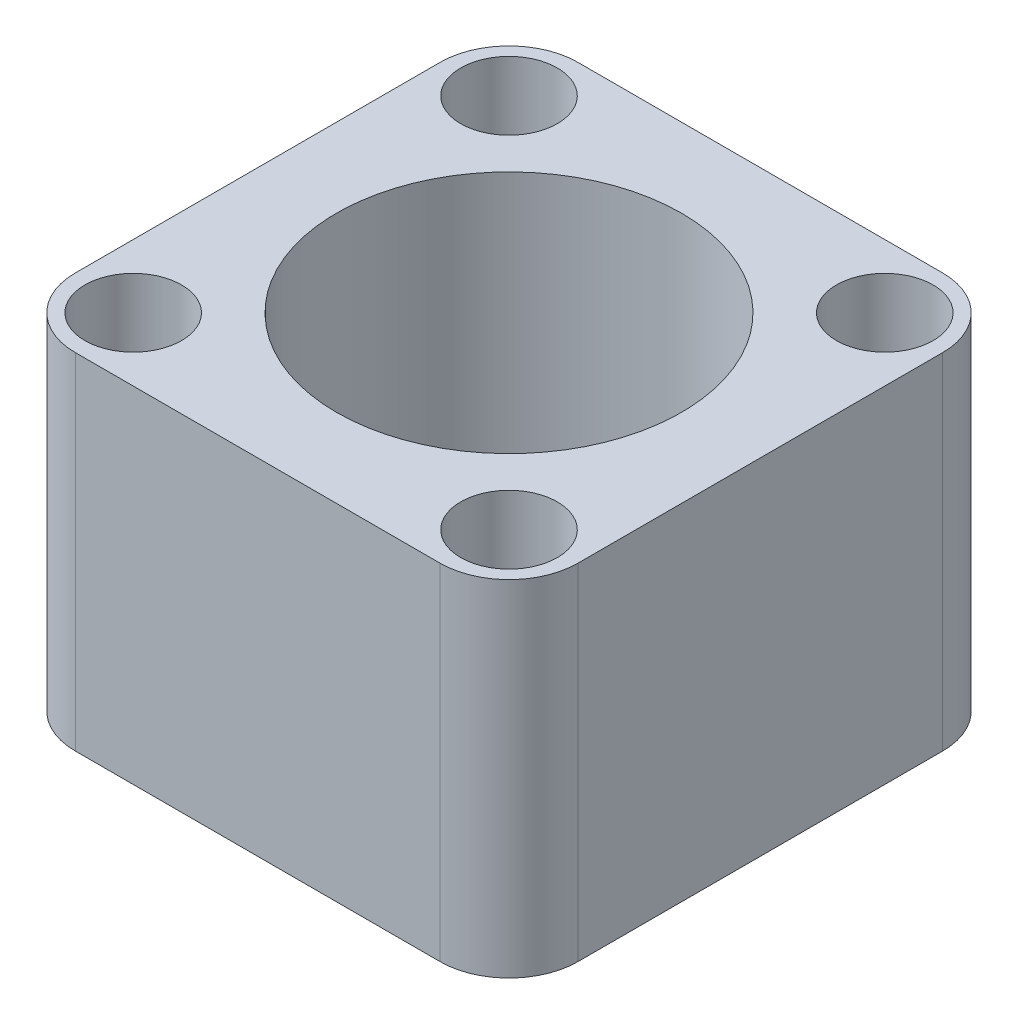
ISO-10303-21;
HEADER;
FILE_DESCRIPTION(('STEP AP214'),'2;1');
FILE_NAME('part.step','',(''),(''),'','','');
FILE_SCHEMA(('AUTOMOTIVE_DESIGN { 1 0 10303 214 1 1 1 1 }'));
ENDSEC;
DATA;
#1=APPLICATION_CONTEXT('core data for automotive mechanical design processes');
#2=APPLICATION_PROTOCOL_DEFINITION('international standard','automotive_design',2000,#1);
#3=PRODUCT_CONTEXT('',#1,'mechanical');
#4=PRODUCT('Part','Part','',(#3));
#5=PRODUCT_RELATED_PRODUCT_CATEGORY('part','',(#4));
#6=PRODUCT_DEFINITION_FORMATION('','',#4);
#7=PRODUCT_DEFINITION_CONTEXT('part definition',#1,'design');
#8=PRODUCT_DEFINITION('design','',#6,#7);
#9=PRODUCT_DEFINITION_SHAPE('','',#8);
#10=(LENGTH_UNIT() NAMED_UNIT(*) SI_UNIT(.MILLI.,.METRE.));
#11=(NAMED_UNIT(*) PLANE_ANGLE_UNIT() SI_UNIT($,.RADIAN.));
#12=(NAMED_UNIT(*) SI_UNIT($,.STERADIAN.) SOLID_ANGLE_UNIT());
#13=UNCERTAINTY_MEASURE_WITH_UNIT(LENGTH_MEASURE(1.E-05),#10,'distance_accuracy_value','');
#14=(GEOMETRIC_REPRESENTATION_CONTEXT(3) GLOBAL_UNCERTAINTY_ASSIGNED_CONTEXT((#13)) GLOBAL_UNIT_ASSIGNED_CONTEXT((#10,
#11,#12)) REPRESENTATION_CONTEXT('',''));
#15=CARTESIAN_POINT('',(0.,0.,0.));
#16=DIRECTION('',(0.,0.,1.));
#17=DIRECTION('',(1.,0.,0.));
#18=AXIS2_PLACEMENT_3D('',#15,#16,#17);
#19=CARTESIAN_POINT('',(0.,12.7,0.));
#20=DIRECTION('',(-1.,0.,0.));
#21=DIRECTION('',(0.,0.,1.));
#22=AXIS2_PLACEMENT_3D('',#19,#20,#21);
#23=PLANE('',#22);
#24=DIRECTION('',(0.,0.,-1.));
#25=VECTOR('',#24,1.);
#26=CARTESIAN_POINT('',(0.,12.7,0.));
#27=LINE('',#26,#25);
#28=CARTESIAN_POINT('',(0.,12.7,-2.54));
#29=VERTEX_POINT('',#28);
#30=CARTESIAN_POINT('',(0.,12.7,-15.9593276094025));
#31=VERTEX_POINT('',#30);
#32=EDGE_CURVE('E120',#29,#31,#27,.T.);
#33=ORIENTED_EDGE('',*,*,#32,.F.);
#34=DIRECTION('',(0.,-1.,0.));
#35=VECTOR('',#34,1.);
#36=CARTESIAN_POINT('',(0.,0.,-2.54));
#37=LINE('',#36,#35);
#38=CARTESIAN_POINT('',(0.,0.,-2.54));
#39=VERTEX_POINT('',#38);
#40=EDGE_CURVE('E150',#29,#39,#37,.T.);
#41=ORIENTED_EDGE('',*,*,#40,.T.);
#42=DIRECTION('',(0.,0.,-1.));
#43=VECTOR('',#42,1.);
#44=CARTESIAN_POINT('',(0.,0.,0.));
#45=LINE('',#44,#43);
#46=CARTESIAN_POINT('',(0.,0.,-15.9593276094025));
#47=VERTEX_POINT('',#46);
#48=EDGE_CURVE('E104',#39,#47,#45,.T.);
#49=ORIENTED_EDGE('',*,*,#48,.T.);
#50=DIRECTION('',(0.,-1.,0.));
#51=VECTOR('',#50,1.);
#52=CARTESIAN_POINT('',(0.,12.7,-15.9593276094025));
#53=LINE('',#52,#51);
#54=EDGE_CURVE('E148',#47,#31,#53,.F.);
#55=ORIENTED_EDGE('',*,*,#54,.T.);
#56=EDGE_LOOP('',(#33,#41,#49,#55));
#57=FACE_BOUND('',#56,.T.);
#58=ADVANCED_FACE('F33',(#57),#23,.F.);
#59=CARTESIAN_POINT('',(0.,12.7,-18.4993276094025));
#60=DIRECTION('',(0.,0.,1.));
#61=DIRECTION('',(1.,0.,0.));
#62=AXIS2_PLACEMENT_3D('',#59,#60,#61);
#63=PLANE('',#62);
#64=DIRECTION('',(-1.,0.,0.));
#65=VECTOR('',#64,1.);
#66=CARTESIAN_POINT('',(0.,12.7,-18.4993276094025));
#67=LINE('',#66,#65);
#68=CARTESIAN_POINT('',(-2.54,12.7,-18.4993276094025));
#69=VERTEX_POINT('',#68);
#70=CARTESIAN_POINT('',(-15.9593276094025,12.7,-18.4993276094025));
#71=VERTEX_POINT('',#70);
#72=EDGE_CURVE('E154',#69,#71,#67,.T.);
#73=ORIENTED_EDGE('',*,*,#72,.F.);
#74=DIRECTION('',(0.,-1.,0.));
#75=VECTOR('',#74,1.);
#76=CARTESIAN_POINT('',(-2.54,12.7,-18.4993276094025));
#77=LINE('',#76,#75);
#78=CARTESIAN_POINT('',(-2.54,0.,-18.4993276094025));
#79=VERTEX_POINT('',#78);
#80=EDGE_CURVE('E11',#69,#79,#77,.T.);
#81=ORIENTED_EDGE('',*,*,#80,.T.);
#82=DIRECTION('',(-1.,0.,0.));
#83=VECTOR('',#82,1.);
#84=CARTESIAN_POINT('',(0.,0.,-18.4993276094025));
#85=LINE('',#84,#83);
#86=CARTESIAN_POINT('',(-15.9593276094025,0.,-18.4993276094025));
#87=VERTEX_POINT('',#86);
#88=EDGE_CURVE('E164',#79,#87,#85,.T.);
#89=ORIENTED_EDGE('',*,*,#88,.T.);
#90=DIRECTION('',(0.,-1.,0.));
#91=VECTOR('',#90,1.);
#92=CARTESIAN_POINT('',(-15.9593276094025,12.7,-18.4993276094025));
#93=LINE('',#92,#91);
#94=EDGE_CURVE('E41',#87,#71,#93,.F.);
#95=ORIENTED_EDGE('',*,*,#94,.T.);
#96=EDGE_LOOP('',(#73,#81,#89,#95));
#97=FACE_BOUND('',#96,.T.);
#98=ADVANCED_FACE('F191',(#97),#63,.F.);
#99=CARTESIAN_POINT('',(-18.4993276094025,12.7,0.));
#100=DIRECTION('',(-1.,0.,0.));
#101=DIRECTION('',(0.,0.,1.));
#102=AXIS2_PLACEMENT_3D('',#99,#100,#101);
#103=PLANE('',#102);
#104=DIRECTION('',(0.,0.,-1.));
#105=VECTOR('',#104,1.);
#106=CARTESIAN_POINT('',(-18.4993276094025,0.,0.));
#107=LINE('',#106,#105);
#108=CARTESIAN_POINT('',(-18.4993276094025,0.,-2.54));
#109=VERTEX_POINT('',#108);
#110=CARTESIAN_POINT('',(-18.4993276094025,0.,-15.9593276094025));
#111=VERTEX_POINT('',#110);
#112=EDGE_CURVE('E121',#109,#111,#107,.T.);
#113=ORIENTED_EDGE('',*,*,#112,.F.);
#114=DIRECTION('',(0.,-1.,0.));
#115=VECTOR('',#114,1.);
#116=CARTESIAN_POINT('',(-18.4993276094025,12.7,-2.54));
#117=LINE('',#116,#115);
#118=CARTESIAN_POINT('',(-18.4993276094025,12.7,-2.54));
#119=VERTEX_POINT('',#118);
#120=EDGE_CURVE('E140',#109,#119,#117,.F.);
#121=ORIENTED_EDGE('',*,*,#120,.T.);
#122=DIRECTION('',(0.,0.,-1.));
#123=VECTOR('',#122,1.);
#124=CARTESIAN_POINT('',(-18.4993276094025,12.7,0.));
#125=LINE('',#124,#123);
#126=CARTESIAN_POINT('',(-18.4993276094025,12.7,-15.9593276094025));
#127=VERTEX_POINT('',#126);
#128=EDGE_CURVE('E130',#119,#127,#125,.T.);
#129=ORIENTED_EDGE('',*,*,#128,.T.);
#130=DIRECTION('',(0.,-1.,0.));
#131=VECTOR('',#130,1.);
#132=CARTESIAN_POINT('',(-18.4993276094025,0.,-15.9593276094025));
#133=LINE('',#132,#131);
#134=EDGE_CURVE('E137',#127,#111,#133,.T.);
#135=ORIENTED_EDGE('',*,*,#134,.T.);
#136=EDGE_LOOP('',(#113,#121,#129,#135));
#137=FACE_BOUND('',#136,.T.);
#138=ADVANCED_FACE('F170',(#137),#103,.T.);
#139=CARTESIAN_POINT('',(0.,12.7,0.));
#140=DIRECTION('',(0.,0.,1.));
#141=DIRECTION('',(1.,0.,0.));
#142=AXIS2_PLACEMENT_3D('',#139,#140,#141);
#143=PLANE('',#142);
#144=DIRECTION('',(-1.,0.,0.));
#145=VECTOR('',#144,1.);
#146=CARTESIAN_POINT('',(0.,12.7,0.));
#147=LINE('',#146,#145);
#148=CARTESIAN_POINT('',(-2.54,12.7,0.));
#149=VERTEX_POINT('',#148);
#150=CARTESIAN_POINT('',(-15.9593276094025,12.7,0.));
#151=VERTEX_POINT('',#150);
#152=EDGE_CURVE('E126',#149,#151,#147,.T.);
#153=ORIENTED_EDGE('',*,*,#152,.T.);
#154=DIRECTION('',(0.,-1.,0.));
#155=VECTOR('',#154,1.);
#156=CARTESIAN_POINT('',(-15.9593276094025,12.7,0.));
#157=LINE('',#156,#155);
#158=CARTESIAN_POINT('',(-15.9593276094025,0.,0.));
#159=VERTEX_POINT('',#158);
#160=EDGE_CURVE('E119',#151,#159,#157,.T.);
#161=ORIENTED_EDGE('',*,*,#160,.T.);
#162=DIRECTION('',(-1.,0.,0.));
#163=VECTOR('',#162,1.);
#164=CARTESIAN_POINT('',(0.,0.,0.));
#165=LINE('',#164,#163);
#166=CARTESIAN_POINT('',(-2.54,0.,0.));
#167=VERTEX_POINT('',#166);
#168=EDGE_CURVE('E102',#167,#159,#165,.T.);
#169=ORIENTED_EDGE('',*,*,#168,.F.);
#170=DIRECTION('',(0.,-1.,0.));
#171=VECTOR('',#170,1.);
#172=CARTESIAN_POINT('',(-2.54,12.7,0.));
#173=LINE('',#172,#171);
#174=EDGE_CURVE('E116',#167,#149,#173,.F.);
#175=ORIENTED_EDGE('',*,*,#174,.T.);
#176=EDGE_LOOP('',(#153,#161,#169,#175));
#177=FACE_BOUND('',#176,.T.);
#178=ADVANCED_FACE('F115',(#177),#143,.T.);
#179=CARTESIAN_POINT('',(0.,12.7,0.));
#180=DIRECTION('',(0.,1.,0.));
#181=DIRECTION('',(0.,0.,1.));
#182=AXIS2_PLACEMENT_3D('',#179,#180,#181);
#183=PLANE('',#182);
#184=CARTESIAN_POINT('',(-2.33486659147798,12.7,-16.1644610179245));
#185=DIRECTION('',(0.,1.,0.));
#186=DIRECTION('',(0.,0.,-1.));
#187=AXIS2_PLACEMENT_3D('',#184,#185,#186);
#188=CIRCLE('',#187,1.778);
#189=CARTESIAN_POINT('',(-2.33486659147798,12.7,-14.3864610179245));
#190=VERTEX_POINT('',#189);
#191=EDGE_CURVE('E318',#190,#190,#188,.T.);
#192=ORIENTED_EDGE('',*,*,#191,.F.);
#193=EDGE_LOOP('',(#192));
#194=FACE_BOUND('',#193,.T.);
#195=CARTESIAN_POINT('',(-16.1644610179245,12.7,-16.1644610179245));
#196=DIRECTION('',(0.,1.,0.));
#197=DIRECTION('',(0.,0.,-1.));
#198=AXIS2_PLACEMENT_3D('',#195,#196,#197);
#199=CIRCLE('',#198,1.778);
#200=CARTESIAN_POINT('',(-16.1644610179245,12.7,-14.3864610179245));
#201=VERTEX_POINT('',#200);
#202=EDGE_CURVE('E320',#201,#201,#199,.T.);
#203=ORIENTED_EDGE('',*,*,#202,.F.);
#204=EDGE_LOOP('',(#203));
#205=FACE_BOUND('',#204,.T.);
#206=CARTESIAN_POINT('',(-16.1644610179245,12.7,-2.33486659147798));
#207=DIRECTION('',(0.,1.,0.));
#208=DIRECTION('',(0.,0.,1.));
#209=AXIS2_PLACEMENT_3D('',#206,#207,#208);
#210=CIRCLE('',#209,1.778);
#211=CARTESIAN_POINT('',(-16.1644610179245,12.7,-0.556866591477977));
#212=VERTEX_POINT('',#211);
#213=EDGE_CURVE('E328',#212,#212,#210,.T.);
#214=ORIENTED_EDGE('',*,*,#213,.F.);
#215=EDGE_LOOP('',(#214));
#216=FACE_BOUND('',#215,.T.);
#217=CARTESIAN_POINT('',(-2.33486659147798,12.7,-2.33486659147798));
#218=DIRECTION('',(0.,1.,0.));
#219=DIRECTION('',(0.,0.,1.));
#220=AXIS2_PLACEMENT_3D('',#217,#218,#219);
#221=CIRCLE('',#220,1.778);
#222=CARTESIAN_POINT('',(-2.33486659147798,12.7,-0.556866591477977));
#223=VERTEX_POINT('',#222);
#224=EDGE_CURVE('E334',#223,#223,#221,.T.);
#225=ORIENTED_EDGE('',*,*,#224,.F.);
#226=EDGE_LOOP('',(#225));
#227=FACE_BOUND('',#226,.T.);
#228=CARTESIAN_POINT('',(-9.24966380470123,12.7,-9.24966380470123));
#229=DIRECTION('',(0.,1.,0.));
#230=DIRECTION('',(0.,0.,1.));
#231=AXIS2_PLACEMENT_3D('',#228,#229,#230);
#232=CIRCLE('',#231,6.35);
#233=CARTESIAN_POINT('',(-9.24966380470123,12.7,-2.89966380470123));
#234=VERTEX_POINT('',#233);
#235=EDGE_CURVE('E339',#234,#234,#232,.T.);
#236=ORIENTED_EDGE('',*,*,#235,.F.);
#237=EDGE_LOOP('',(#236));
#238=FACE_BOUND('',#237,.T.);
#239=ORIENTED_EDGE('',*,*,#128,.F.);
#240=CARTESIAN_POINT('',(-15.9593276094025,12.7,-2.54));
#241=DIRECTION('',(0.,1.,0.));
#242=DIRECTION('',(0.,0.,1.));
#243=AXIS2_PLACEMENT_3D('',#240,#241,#242);
#244=CIRCLE('',#243,2.54);
#245=EDGE_CURVE('E146',#119,#151,#244,.T.);
#246=ORIENTED_EDGE('',*,*,#245,.T.);
#247=ORIENTED_EDGE('',*,*,#152,.F.);
#248=CARTESIAN_POINT('',(-2.54,12.7,-2.54));
#249=DIRECTION('',(0.,1.,0.));
#250=DIRECTION('',(0.,0.,1.));
#251=AXIS2_PLACEMENT_3D('',#248,#249,#250);
#252=CIRCLE('',#251,2.54);
#253=EDGE_CURVE('E125',#149,#29,#252,.T.);
#254=ORIENTED_EDGE('',*,*,#253,.T.);
#255=ORIENTED_EDGE('',*,*,#32,.T.);
#256=CARTESIAN_POINT('',(-2.54,12.7,-15.9593276094025));
#257=DIRECTION('',(0.,1.,0.));
#258=DIRECTION('',(0.,0.,1.));
#259=AXIS2_PLACEMENT_3D('',#256,#257,#258);
#260=CIRCLE('',#259,2.54);
#261=EDGE_CURVE('E54',#31,#69,#260,.T.);
#262=ORIENTED_EDGE('',*,*,#261,.T.);
#263=ORIENTED_EDGE('',*,*,#72,.T.);
#264=CARTESIAN_POINT('',(-15.9593276094025,12.7,-15.9593276094025));
#265=DIRECTION('',(0.,1.,0.));
#266=DIRECTION('',(0.,0.,1.));
#267=AXIS2_PLACEMENT_3D('',#264,#265,#266);
#268=CIRCLE('',#267,2.54);
#269=EDGE_CURVE('E142',#71,#127,#268,.T.);
#270=ORIENTED_EDGE('',*,*,#269,.T.);
#271=EDGE_LOOP('',(#239,#246,#247,#254,#255,#262,#263,#270));
#272=FACE_BOUND('',#271,.T.);
#273=ADVANCED_FACE('F176',(#194,#205,#216,#227,#238,#272),#183,.T.);
#274=CARTESIAN_POINT('',(0.,0.,0.));
#275=DIRECTION('',(0.,1.,0.));
#276=DIRECTION('',(0.,0.,1.));
#277=AXIS2_PLACEMENT_3D('',#274,#275,#276);
#278=PLANE('',#277);
#279=CARTESIAN_POINT('',(-2.33486659147798,0.,-16.1644610179245));
#280=DIRECTION('',(0.,1.,0.));
#281=DIRECTION('',(0.,0.,1.));
#282=AXIS2_PLACEMENT_3D('',#279,#280,#281);
#283=CIRCLE('',#282,1.778);
#284=CARTESIAN_POINT('',(-2.33486659147798,0.,-14.3864610179245));
#285=VERTEX_POINT('',#284);
#286=EDGE_CURVE('E315',#285,#285,#283,.F.);
#287=ORIENTED_EDGE('',*,*,#286,.F.);
#288=EDGE_LOOP('',(#287));
#289=FACE_BOUND('',#288,.T.);
#290=CARTESIAN_POINT('',(-16.1644610179245,0.,-16.1644610179245));
#291=DIRECTION('',(0.,1.,0.));
#292=DIRECTION('',(0.,0.,1.));
#293=AXIS2_PLACEMENT_3D('',#290,#291,#292);
#294=CIRCLE('',#293,1.778);
#295=CARTESIAN_POINT('',(-16.1644610179245,0.,-14.3864610179245));
#296=VERTEX_POINT('',#295);
#297=EDGE_CURVE('E325',#296,#296,#294,.F.);
#298=ORIENTED_EDGE('',*,*,#297,.F.);
#299=EDGE_LOOP('',(#298));
#300=FACE_BOUND('',#299,.T.);
#301=CARTESIAN_POINT('',(-16.1644610179245,0.,-2.33486659147798));
#302=DIRECTION('',(0.,1.,0.));
#303=DIRECTION('',(0.,0.,1.));
#304=AXIS2_PLACEMENT_3D('',#301,#302,#303);
#305=CIRCLE('',#304,1.778);
#306=CARTESIAN_POINT('',(-16.1644610179245,0.,-0.556866591477977));
#307=VERTEX_POINT('',#306);
#308=EDGE_CURVE('E331',#307,#307,#305,.F.);
#309=ORIENTED_EDGE('',*,*,#308,.F.);
#310=EDGE_LOOP('',(#309));
#311=FACE_BOUND('',#310,.T.);
#312=CARTESIAN_POINT('',(-2.33486659147798,0.,-2.33486659147798));
#313=DIRECTION('',(0.,1.,0.));
#314=DIRECTION('',(0.,0.,1.));
#315=AXIS2_PLACEMENT_3D('',#312,#313,#314);
#316=CIRCLE('',#315,1.778);
#317=CARTESIAN_POINT('',(-2.33486659147798,0.,-0.556866591477977));
#318=VERTEX_POINT('',#317);
#319=EDGE_CURVE('E337',#318,#318,#316,.F.);
#320=ORIENTED_EDGE('',*,*,#319,.F.);
#321=EDGE_LOOP('',(#320));
#322=FACE_BOUND('',#321,.T.);
#323=CARTESIAN_POINT('',(-9.24966380470123,0.,-9.24966380470123));
#324=DIRECTION('',(0.,1.,0.));
#325=DIRECTION('',(0.,0.,1.));
#326=AXIS2_PLACEMENT_3D('',#323,#324,#325);
#327=CIRCLE('',#326,6.35);
#328=CARTESIAN_POINT('',(-9.24966380470123,0.,-2.89966380470123));
#329=VERTEX_POINT('',#328);
#330=EDGE_CURVE('E158',#329,#329,#327,.F.);
#331=ORIENTED_EDGE('',*,*,#330,.F.);
#332=EDGE_LOOP('',(#331));
#333=FACE_BOUND('',#332,.T.);
#334=ORIENTED_EDGE('',*,*,#168,.T.);
#335=CARTESIAN_POINT('',(-15.9593276094025,0.,-2.54));
#336=DIRECTION('',(0.,1.,0.));
#337=DIRECTION('',(0.,0.,1.));
#338=AXIS2_PLACEMENT_3D('',#335,#336,#337);
#339=CIRCLE('',#338,2.54);
#340=EDGE_CURVE('E109',#159,#109,#339,.F.);
#341=ORIENTED_EDGE('',*,*,#340,.T.);
#342=ORIENTED_EDGE('',*,*,#112,.T.);
#343=CARTESIAN_POINT('',(-15.9593276094025,0.,-15.9593276094025));
#344=DIRECTION('',(0.,1.,0.));
#345=DIRECTION('',(0.,0.,1.));
#346=AXIS2_PLACEMENT_3D('',#343,#344,#345);
#347=CIRCLE('',#346,2.54);
#348=EDGE_CURVE('E128',#111,#87,#347,.F.);
#349=ORIENTED_EDGE('',*,*,#348,.T.);
#350=ORIENTED_EDGE('',*,*,#88,.F.);
#351=CARTESIAN_POINT('',(-2.54,0.,-15.9593276094025));
#352=DIRECTION('',(0.,1.,0.));
#353=DIRECTION('',(0.,0.,1.));
#354=AXIS2_PLACEMENT_3D('',#351,#352,#353);
#355=CIRCLE('',#354,2.54);
#356=EDGE_CURVE('E110',#79,#47,#355,.F.);
#357=ORIENTED_EDGE('',*,*,#356,.T.);
#358=ORIENTED_EDGE('',*,*,#48,.F.);
#359=CARTESIAN_POINT('',(-2.54,0.,-2.54));
#360=DIRECTION('',(0.,1.,0.));
#361=DIRECTION('',(0.,0.,1.));
#362=AXIS2_PLACEMENT_3D('',#359,#360,#361);
#363=CIRCLE('',#362,2.54);
#364=EDGE_CURVE('E99',#39,#167,#363,.F.);
#365=ORIENTED_EDGE('',*,*,#364,.T.);
#366=EDGE_LOOP('',(#334,#341,#342,#349,#350,#357,#358,#365));
#367=FACE_BOUND('',#366,.T.);
#368=ADVANCED_FACE('F101',(#289,#300,#311,#322,#333,#367),#278,.F.);
#369=CARTESIAN_POINT('',(-15.9593276094025,12.7,-2.54));
#370=DIRECTION('',(0.,-1.,0.));
#371=DIRECTION('',(0.,0.,-1.));
#372=AXIS2_PLACEMENT_3D('',#369,#370,#371);
#373=CYLINDRICAL_SURFACE('',#372,2.54);
#374=ORIENTED_EDGE('',*,*,#245,.F.);
#375=ORIENTED_EDGE('',*,*,#120,.F.);
#376=ORIENTED_EDGE('',*,*,#340,.F.);
#377=ORIENTED_EDGE('',*,*,#160,.F.);
#378=EDGE_LOOP('',(#374,#375,#376,#377));
#379=FACE_BOUND('',#378,.T.);
#380=ADVANCED_FACE('F175',(#379),#373,.T.);
#381=CARTESIAN_POINT('',(-2.54,12.7,-2.54));
#382=DIRECTION('',(0.,1.,0.));
#383=DIRECTION('',(0.,0.,1.));
#384=AXIS2_PLACEMENT_3D('',#381,#382,#383);
#385=CYLINDRICAL_SURFACE('',#384,2.54);
#386=ORIENTED_EDGE('',*,*,#253,.F.);
#387=ORIENTED_EDGE('',*,*,#174,.F.);
#388=ORIENTED_EDGE('',*,*,#364,.F.);
#389=ORIENTED_EDGE('',*,*,#40,.F.);
#390=EDGE_LOOP('',(#386,#387,#388,#389));
#391=FACE_BOUND('',#390,.T.);
#392=ADVANCED_FACE('F124',(#391),#385,.T.);
#393=CARTESIAN_POINT('',(-2.54,12.7,-15.9593276094025));
#394=DIRECTION('',(0.,-1.,0.));
#395=DIRECTION('',(0.,0.,-1.));
#396=AXIS2_PLACEMENT_3D('',#393,#394,#395);
#397=CYLINDRICAL_SURFACE('',#396,2.54);
#398=ORIENTED_EDGE('',*,*,#261,.F.);
#399=ORIENTED_EDGE('',*,*,#54,.F.);
#400=ORIENTED_EDGE('',*,*,#356,.F.);
#401=ORIENTED_EDGE('',*,*,#80,.F.);
#402=EDGE_LOOP('',(#398,#399,#400,#401));
#403=FACE_BOUND('',#402,.T.);
#404=ADVANCED_FACE('F181',(#403),#397,.T.);
#405=CARTESIAN_POINT('',(-15.9593276094025,12.7,-15.9593276094025));
#406=DIRECTION('',(0.,1.,0.));
#407=DIRECTION('',(0.,0.,1.));
#408=AXIS2_PLACEMENT_3D('',#405,#406,#407);
#409=CYLINDRICAL_SURFACE('',#408,2.54);
#410=ORIENTED_EDGE('',*,*,#269,.F.);
#411=ORIENTED_EDGE('',*,*,#94,.F.);
#412=ORIENTED_EDGE('',*,*,#348,.F.);
#413=ORIENTED_EDGE('',*,*,#134,.F.);
#414=EDGE_LOOP('',(#410,#411,#412,#413));
#415=FACE_BOUND('',#414,.T.);
#416=ADVANCED_FACE('F35',(#415),#409,.T.);
#417=CARTESIAN_POINT('',(-9.24966380470123,-17.9605122421383,-9.24966380470123));
#418=DIRECTION('',(0.,1.,0.));
#419=DIRECTION('',(0.,0.,1.));
#420=AXIS2_PLACEMENT_3D('',#417,#418,#419);
#421=CYLINDRICAL_SURFACE('',#420,6.35);
#422=CARTESIAN_POINT('',(-9.24966380470123,0.,-2.89966380470123));
#423=CARTESIAN_POINT('',(-9.24966380470123,0.132291666666664,-2.89966380470123));
#424=CARTESIAN_POINT('',(-9.24966380470123,0.264583333333331,-2.89966380470123));
#425=CARTESIAN_POINT('',(-9.24966380470123,0.529166666666664,-2.89966380470123));
#426=CARTESIAN_POINT('',(-9.24966380470123,0.66145833333333,-2.89966380470123));
#427=CARTESIAN_POINT('',(-9.24966380470123,0.926041666666663,-2.89966380470123));
#428=CARTESIAN_POINT('',(-9.24966380470123,1.05833333333333,-2.89966380470123));
#429=CARTESIAN_POINT('',(-9.24966380470123,1.32291666666666,-2.89966380470123));
#430=CARTESIAN_POINT('',(-9.24966380470123,1.45520833333333,-2.89966380470123));
#431=CARTESIAN_POINT('',(-9.24966380470123,1.71979166666666,-2.89966380470123));
#432=CARTESIAN_POINT('',(-9.24966380470123,1.85208333333333,-2.89966380470123));
#433=CARTESIAN_POINT('',(-9.24966380470123,2.11666666666666,-2.89966380470123));
#434=CARTESIAN_POINT('',(-9.24966380470123,2.24895833333333,-2.89966380470123));
#435=CARTESIAN_POINT('',(-9.24966380470123,2.51354166666666,-2.89966380470123));
#436=CARTESIAN_POINT('',(-9.24966380470123,2.64583333333333,-2.89966380470123));
#437=CARTESIAN_POINT('',(-9.24966380470123,2.91041666666666,-2.89966380470123));
#438=CARTESIAN_POINT('',(-9.24966380470123,3.04270833333333,-2.89966380470123));
#439=CARTESIAN_POINT('',(-9.24966380470123,3.30729166666666,-2.89966380470123));
#440=CARTESIAN_POINT('',(-9.24966380470123,3.43958333333333,-2.89966380470123));
#441=CARTESIAN_POINT('',(-9.24966380470123,3.70416666666666,-2.89966380470123));
#442=CARTESIAN_POINT('',(-9.24966380470123,3.83645833333333,-2.89966380470123));
#443=CARTESIAN_POINT('',(-9.24966380470123,4.10104166666666,-2.89966380470123));
#444=CARTESIAN_POINT('',(-9.24966380470123,4.23333333333333,-2.89966380470123));
#445=CARTESIAN_POINT('',(-9.24966380470123,4.49791666666667,-2.89966380470123));
#446=CARTESIAN_POINT('',(-9.24966380470123,4.63020833333333,-2.89966380470123));
#447=CARTESIAN_POINT('',(-9.24966380470123,4.89479166666667,-2.89966380470123));
#448=CARTESIAN_POINT('',(-9.24966380470123,5.02708333333333,-2.89966380470123));
#449=CARTESIAN_POINT('',(-9.24966380470123,5.29166666666666,-2.89966380470123));
#450=CARTESIAN_POINT('',(-9.24966380470123,5.42395833333333,-2.89966380470123));
#451=CARTESIAN_POINT('',(-9.24966380470123,5.68854166666667,-2.89966380470123));
#452=CARTESIAN_POINT('',(-9.24966380470123,5.82083333333333,-2.89966380470123));
#453=CARTESIAN_POINT('',(-9.24966380470123,6.08541666666667,-2.89966380470123));
#454=CARTESIAN_POINT('',(-9.24966380470123,6.21770833333333,-2.89966380470123));
#455=CARTESIAN_POINT('',(-9.24966380470123,6.48229166666666,-2.89966380470123));
#456=CARTESIAN_POINT('',(-9.24966380470123,6.61458333333333,-2.89966380470123));
#457=CARTESIAN_POINT('',(-9.24966380470123,6.87916666666666,-2.89966380470123));
#458=CARTESIAN_POINT('',(-9.24966380470123,7.01145833333333,-2.89966380470123));
#459=CARTESIAN_POINT('',(-9.24966380470123,7.27604166666666,-2.89966380470123));
#460=CARTESIAN_POINT('',(-9.24966380470123,7.40833333333333,-2.89966380470123));
#461=CARTESIAN_POINT('',(-9.24966380470123,7.67291666666666,-2.89966380470123));
#462=CARTESIAN_POINT('',(-9.24966380470123,7.80520833333333,-2.89966380470123));
#463=CARTESIAN_POINT('',(-9.24966380470123,8.06979166666666,-2.89966380470123));
#464=CARTESIAN_POINT('',(-9.24966380470123,8.20208333333333,-2.89966380470123));
#465=CARTESIAN_POINT('',(-9.24966380470123,8.46666666666667,-2.89966380470123));
#466=CARTESIAN_POINT('',(-9.24966380470123,8.59895833333333,-2.89966380470123));
#467=CARTESIAN_POINT('',(-9.24966380470123,8.86354166666666,-2.89966380470123));
#468=CARTESIAN_POINT('',(-9.24966380470123,8.99583333333333,-2.89966380470123));
#469=CARTESIAN_POINT('',(-9.24966380470123,9.26041666666666,-2.89966380470123));
#470=CARTESIAN_POINT('',(-9.24966380470123,9.39270833333333,-2.89966380470123));
#471=CARTESIAN_POINT('',(-9.24966380470123,9.65729166666667,-2.89966380470123));
#472=CARTESIAN_POINT('',(-9.24966380470123,9.78958333333333,-2.89966380470123));
#473=CARTESIAN_POINT('',(-9.24966380470123,10.0541666666667,-2.89966380470123));
#474=CARTESIAN_POINT('',(-9.24966380470123,10.1864583333333,-2.89966380470123));
#475=CARTESIAN_POINT('',(-9.24966380470123,10.4510416666667,-2.89966380470123));
#476=CARTESIAN_POINT('',(-9.24966380470123,10.5833333333333,-2.89966380470123));
#477=CARTESIAN_POINT('',(-9.24966380470123,10.8479166666667,-2.89966380470123));
#478=CARTESIAN_POINT('',(-9.24966380470123,10.9802083333333,-2.89966380470123));
#479=CARTESIAN_POINT('',(-9.24966380470123,11.2447916666667,-2.89966380470123));
#480=CARTESIAN_POINT('',(-9.24966380470123,11.3770833333333,-2.89966380470123));
#481=CARTESIAN_POINT('',(-9.24966380470123,11.6416666666667,-2.89966380470123));
#482=CARTESIAN_POINT('',(-9.24966380470123,11.7739583333333,-2.89966380470123));
#483=CARTESIAN_POINT('',(-9.24966380470123,12.0385416666667,-2.89966380470123));
#484=CARTESIAN_POINT('',(-9.24966380470123,12.1708333333333,-2.89966380470123));
#485=CARTESIAN_POINT('',(-9.24966380470123,12.4354166666667,-2.89966380470123));
#486=CARTESIAN_POINT('',(-9.24966380470123,12.5677083333333,-2.89966380470123));
#487=CARTESIAN_POINT('',(-9.24966380470123,12.7,-2.89966380470123));
#488=B_SPLINE_CURVE_WITH_KNOTS('',3,(#422,#423,#424,#425,#426,#427,#428,#429,#430,#431,#432,
#433,#434,#435,#436,#437,#438,#439,#440,#441,#442,#443,#444,#445,#446,#447,#448,#449,#450,#451,
#452,#453,#454,#455,#456,#457,#458,#459,#460,#461,#462,#463,#464,#465,#466,#467,#468,#469,#470,
#471,#472,#473,#474,#475,#476,#477,#478,#479,#480,#481,#482,#483,#484,#485,#486,#487),
.UNSPECIFIED.,.F.,.F.,(4,2,2,2,2,2,2,2,2,2,2,2,2,2,2,2,2,2,2,2,2,2,2,2,2,2,2,2,2,2,2,2,4),(0.,
0.396875000000001,0.793749999999999,1.190625,1.5875,1.984375,2.38125,2.778125,3.175,3.571875,
3.96875,4.365625,4.7625,5.159375,5.55625,5.953125,6.35,6.746875,7.14375,7.540625,7.9375,
8.334375,8.73125,9.128125,9.525,9.921875,10.31875,10.715625,11.1125,11.509375,11.90625,
12.303125,12.7),.UNSPECIFIED.);
#489=EDGE_CURVE('BSEAM180',#329,#234,#488,.T.);
#490=ORIENTED_EDGE('',*,*,#330,.T.);
#491=ORIENTED_EDGE('',*,*,#235,.T.);
#492=ORIENTED_EDGE('',*,*,#489,.T.);
#493=ORIENTED_EDGE('',*,*,#489,.F.);
#494=EDGE_LOOP('',(#490,#492,#491,#493));
#495=FACE_BOUND('',#494,.T.);
#496=ADVANCED_FACE('F180',(#495),#421,.F.);
#497=CARTESIAN_POINT('',(-2.33486659147798,-17.9605122421383,-2.33486659147798));
#498=DIRECTION('',(0.,1.,0.));
#499=DIRECTION('',(0.,0.,1.));
#500=AXIS2_PLACEMENT_3D('',#497,#498,#499);
#501=CYLINDRICAL_SURFACE('',#500,1.778);
#502=CARTESIAN_POINT('',(-2.33486659147798,0.,-0.556866591477977));
#503=CARTESIAN_POINT('',(-2.33486659147798,0.132291666666664,-0.556866591477977));
#504=CARTESIAN_POINT('',(-2.33486659147798,0.264583333333331,-0.556866591477977));
#505=CARTESIAN_POINT('',(-2.33486659147798,0.529166666666664,-0.556866591477977));
#506=CARTESIAN_POINT('',(-2.33486659147798,0.66145833333333,-0.556866591477977));
#507=CARTESIAN_POINT('',(-2.33486659147798,0.926041666666663,-0.556866591477977));
#508=CARTESIAN_POINT('',(-2.33486659147798,1.05833333333333,-0.556866591477977));
#509=CARTESIAN_POINT('',(-2.33486659147798,1.32291666666666,-0.556866591477977));
#510=CARTESIAN_POINT('',(-2.33486659147798,1.45520833333333,-0.556866591477977));
#511=CARTESIAN_POINT('',(-2.33486659147798,1.71979166666666,-0.556866591477977));
#512=CARTESIAN_POINT('',(-2.33486659147798,1.85208333333333,-0.556866591477977));
#513=CARTESIAN_POINT('',(-2.33486659147798,2.11666666666666,-0.556866591477977));
#514=CARTESIAN_POINT('',(-2.33486659147798,2.24895833333333,-0.556866591477977));
#515=CARTESIAN_POINT('',(-2.33486659147798,2.51354166666666,-0.556866591477977));
#516=CARTESIAN_POINT('',(-2.33486659147798,2.64583333333333,-0.556866591477977));
#517=CARTESIAN_POINT('',(-2.33486659147798,2.91041666666666,-0.556866591477977));
#518=CARTESIAN_POINT('',(-2.33486659147798,3.04270833333333,-0.556866591477977));
#519=CARTESIAN_POINT('',(-2.33486659147798,3.30729166666666,-0.556866591477977));
#520=CARTESIAN_POINT('',(-2.33486659147798,3.43958333333333,-0.556866591477977));
#521=CARTESIAN_POINT('',(-2.33486659147798,3.70416666666666,-0.556866591477977));
#522=CARTESIAN_POINT('',(-2.33486659147798,3.83645833333333,-0.556866591477977));
#523=CARTESIAN_POINT('',(-2.33486659147798,4.10104166666666,-0.556866591477977));
#524=CARTESIAN_POINT('',(-2.33486659147798,4.23333333333333,-0.556866591477977));
#525=CARTESIAN_POINT('',(-2.33486659147798,4.49791666666667,-0.556866591477977));
#526=CARTESIAN_POINT('',(-2.33486659147798,4.63020833333333,-0.556866591477977));
#527=CARTESIAN_POINT('',(-2.33486659147798,4.89479166666667,-0.556866591477977));
#528=CARTESIAN_POINT('',(-2.33486659147798,5.02708333333333,-0.556866591477977));
#529=CARTESIAN_POINT('',(-2.33486659147798,5.29166666666666,-0.556866591477977));
#530=CARTESIAN_POINT('',(-2.33486659147798,5.42395833333333,-0.556866591477977));
#531=CARTESIAN_POINT('',(-2.33486659147798,5.68854166666667,-0.556866591477977));
#532=CARTESIAN_POINT('',(-2.33486659147798,5.82083333333333,-0.556866591477977));
#533=CARTESIAN_POINT('',(-2.33486659147798,6.08541666666667,-0.556866591477977));
#534=CARTESIAN_POINT('',(-2.33486659147798,6.21770833333333,-0.556866591477977));
#535=CARTESIAN_POINT('',(-2.33486659147798,6.48229166666666,-0.556866591477977));
#536=CARTESIAN_POINT('',(-2.33486659147798,6.61458333333333,-0.556866591477977));
#537=CARTESIAN_POINT('',(-2.33486659147798,6.87916666666666,-0.556866591477977));
#538=CARTESIAN_POINT('',(-2.33486659147798,7.01145833333333,-0.556866591477977));
#539=CARTESIAN_POINT('',(-2.33486659147798,7.27604166666666,-0.556866591477977));
#540=CARTESIAN_POINT('',(-2.33486659147798,7.40833333333333,-0.556866591477977));
#541=CARTESIAN_POINT('',(-2.33486659147798,7.67291666666666,-0.556866591477977));
#542=CARTESIAN_POINT('',(-2.33486659147798,7.80520833333333,-0.556866591477977));
#543=CARTESIAN_POINT('',(-2.33486659147798,8.06979166666666,-0.556866591477977));
#544=CARTESIAN_POINT('',(-2.33486659147798,8.20208333333333,-0.556866591477977));
#545=CARTESIAN_POINT('',(-2.33486659147798,8.46666666666667,-0.556866591477977));
#546=CARTESIAN_POINT('',(-2.33486659147798,8.59895833333333,-0.556866591477977));
#547=CARTESIAN_POINT('',(-2.33486659147798,8.86354166666666,-0.556866591477977));
#548=CARTESIAN_POINT('',(-2.33486659147798,8.99583333333333,-0.556866591477977));
#549=CARTESIAN_POINT('',(-2.33486659147798,9.26041666666666,-0.556866591477977));
#550=CARTESIAN_POINT('',(-2.33486659147798,9.39270833333333,-0.556866591477977));
#551=CARTESIAN_POINT('',(-2.33486659147798,9.65729166666667,-0.556866591477977));
#552=CARTESIAN_POINT('',(-2.33486659147798,9.78958333333333,-0.556866591477977));
#553=CARTESIAN_POINT('',(-2.33486659147798,10.0541666666667,-0.556866591477977));
#554=CARTESIAN_POINT('',(-2.33486659147798,10.1864583333333,-0.556866591477977));
#555=CARTESIAN_POINT('',(-2.33486659147798,10.4510416666667,-0.556866591477977));
#556=CARTESIAN_POINT('',(-2.33486659147798,10.5833333333333,-0.556866591477977));
#557=CARTESIAN_POINT('',(-2.33486659147798,10.8479166666667,-0.556866591477977));
#558=CARTESIAN_POINT('',(-2.33486659147798,10.9802083333333,-0.556866591477977));
#559=CARTESIAN_POINT('',(-2.33486659147798,11.2447916666667,-0.556866591477977));
#560=CARTESIAN_POINT('',(-2.33486659147798,11.3770833333333,-0.556866591477977));
#561=CARTESIAN_POINT('',(-2.33486659147798,11.6416666666667,-0.556866591477977));
#562=CARTESIAN_POINT('',(-2.33486659147798,11.7739583333333,-0.556866591477977));
#563=CARTESIAN_POINT('',(-2.33486659147798,12.0385416666667,-0.556866591477977));
#564=CARTESIAN_POINT('',(-2.33486659147798,12.1708333333333,-0.556866591477977));
#565=CARTESIAN_POINT('',(-2.33486659147798,12.4354166666667,-0.556866591477977));
#566=CARTESIAN_POINT('',(-2.33486659147798,12.5677083333333,-0.556866591477977));
#567=CARTESIAN_POINT('',(-2.33486659147798,12.7,-0.556866591477977));
#568=B_SPLINE_CURVE_WITH_KNOTS('',3,(#502,#503,#504,#505,#506,#507,#508,#509,#510,#511,#512,
#513,#514,#515,#516,#517,#518,#519,#520,#521,#522,#523,#524,#525,#526,#527,#528,#529,#530,#531,
#532,#533,#534,#535,#536,#537,#538,#539,#540,#541,#542,#543,#544,#545,#546,#547,#548,#549,#550,
#551,#552,#553,#554,#555,#556,#557,#558,#559,#560,#561,#562,#563,#564,#565,#566,#567),
.UNSPECIFIED.,.F.,.F.,(4,2,2,2,2,2,2,2,2,2,2,2,2,2,2,2,2,2,2,2,2,2,2,2,2,2,2,2,2,2,2,2,4),(0.,
0.396875000000001,0.793749999999999,1.190625,1.5875,1.984375,2.38125,2.778125,3.175,3.571875,
3.96875,4.365625,4.7625,5.159375,5.55625,5.953125,6.35,6.746875,7.14375,7.540625,7.9375,
8.334375,8.73125,9.128125,9.525,9.921875,10.31875,10.715625,11.1125,11.509375,11.90625,
12.303125,12.7),.UNSPECIFIED.);
#569=EDGE_CURVE('BSEAM186',#318,#223,#568,.T.);
#570=ORIENTED_EDGE('',*,*,#319,.T.);
#571=ORIENTED_EDGE('',*,*,#224,.T.);
#572=ORIENTED_EDGE('',*,*,#569,.T.);
#573=ORIENTED_EDGE('',*,*,#569,.F.);
#574=EDGE_LOOP('',(#570,#572,#571,#573));
#575=FACE_BOUND('',#574,.T.);
#576=ADVANCED_FACE('F186',(#575),#501,.F.);
#577=CARTESIAN_POINT('',(-16.1644610179245,-17.9605122421383,-2.33486659147798));
#578=DIRECTION('',(0.,1.,0.));
#579=DIRECTION('',(0.,0.,1.));
#580=AXIS2_PLACEMENT_3D('',#577,#578,#579);
#581=CYLINDRICAL_SURFACE('',#580,1.778);
#582=CARTESIAN_POINT('',(-16.1644610179245,0.,-0.556866591477977));
#583=CARTESIAN_POINT('',(-16.1644610179245,0.132291666666664,-0.556866591477977));
#584=CARTESIAN_POINT('',(-16.1644610179245,0.264583333333331,-0.556866591477977));
#585=CARTESIAN_POINT('',(-16.1644610179245,0.529166666666664,-0.556866591477977));
#586=CARTESIAN_POINT('',(-16.1644610179245,0.66145833333333,-0.556866591477977));
#587=CARTESIAN_POINT('',(-16.1644610179245,0.926041666666663,-0.556866591477977));
#588=CARTESIAN_POINT('',(-16.1644610179245,1.05833333333333,-0.556866591477977));
#589=CARTESIAN_POINT('',(-16.1644610179245,1.32291666666666,-0.556866591477977));
#590=CARTESIAN_POINT('',(-16.1644610179245,1.45520833333333,-0.556866591477977));
#591=CARTESIAN_POINT('',(-16.1644610179245,1.71979166666666,-0.556866591477977));
#592=CARTESIAN_POINT('',(-16.1644610179245,1.85208333333333,-0.556866591477977));
#593=CARTESIAN_POINT('',(-16.1644610179245,2.11666666666666,-0.556866591477977));
#594=CARTESIAN_POINT('',(-16.1644610179245,2.24895833333333,-0.556866591477977));
#595=CARTESIAN_POINT('',(-16.1644610179245,2.51354166666666,-0.556866591477977));
#596=CARTESIAN_POINT('',(-16.1644610179245,2.64583333333333,-0.556866591477977));
#597=CARTESIAN_POINT('',(-16.1644610179245,2.91041666666666,-0.556866591477977));
#598=CARTESIAN_POINT('',(-16.1644610179245,3.04270833333333,-0.556866591477977));
#599=CARTESIAN_POINT('',(-16.1644610179245,3.30729166666666,-0.556866591477977));
#600=CARTESIAN_POINT('',(-16.1644610179245,3.43958333333333,-0.556866591477977));
#601=CARTESIAN_POINT('',(-16.1644610179245,3.70416666666666,-0.556866591477977));
#602=CARTESIAN_POINT('',(-16.1644610179245,3.83645833333333,-0.556866591477977));
#603=CARTESIAN_POINT('',(-16.1644610179245,4.10104166666666,-0.556866591477977));
#604=CARTESIAN_POINT('',(-16.1644610179245,4.23333333333333,-0.556866591477977));
#605=CARTESIAN_POINT('',(-16.1644610179245,4.49791666666667,-0.556866591477977));
#606=CARTESIAN_POINT('',(-16.1644610179245,4.63020833333333,-0.556866591477977));
#607=CARTESIAN_POINT('',(-16.1644610179245,4.89479166666667,-0.556866591477977));
#608=CARTESIAN_POINT('',(-16.1644610179245,5.02708333333333,-0.556866591477977));
#609=CARTESIAN_POINT('',(-16.1644610179245,5.29166666666666,-0.556866591477977));
#610=CARTESIAN_POINT('',(-16.1644610179245,5.42395833333333,-0.556866591477977));
#611=CARTESIAN_POINT('',(-16.1644610179245,5.68854166666667,-0.556866591477977));
#612=CARTESIAN_POINT('',(-16.1644610179245,5.82083333333333,-0.556866591477977));
#613=CARTESIAN_POINT('',(-16.1644610179245,6.08541666666667,-0.556866591477977));
#614=CARTESIAN_POINT('',(-16.1644610179245,6.21770833333333,-0.556866591477977));
#615=CARTESIAN_POINT('',(-16.1644610179245,6.48229166666666,-0.556866591477977));
#616=CARTESIAN_POINT('',(-16.1644610179245,6.61458333333333,-0.556866591477977));
#617=CARTESIAN_POINT('',(-16.1644610179245,6.87916666666666,-0.556866591477977));
#618=CARTESIAN_POINT('',(-16.1644610179245,7.01145833333333,-0.556866591477977));
#619=CARTESIAN_POINT('',(-16.1644610179245,7.27604166666666,-0.556866591477977));
#620=CARTESIAN_POINT('',(-16.1644610179245,7.40833333333333,-0.556866591477977));
#621=CARTESIAN_POINT('',(-16.1644610179245,7.67291666666666,-0.556866591477977));
#622=CARTESIAN_POINT('',(-16.1644610179245,7.80520833333333,-0.556866591477977));
#623=CARTESIAN_POINT('',(-16.1644610179245,8.06979166666666,-0.556866591477977));
#624=CARTESIAN_POINT('',(-16.1644610179245,8.20208333333333,-0.556866591477977));
#625=CARTESIAN_POINT('',(-16.1644610179245,8.46666666666667,-0.556866591477977));
#626=CARTESIAN_POINT('',(-16.1644610179245,8.59895833333333,-0.556866591477977));
#627=CARTESIAN_POINT('',(-16.1644610179245,8.86354166666666,-0.556866591477977));
#628=CARTESIAN_POINT('',(-16.1644610179245,8.99583333333333,-0.556866591477977));
#629=CARTESIAN_POINT('',(-16.1644610179245,9.26041666666666,-0.556866591477977));
#630=CARTESIAN_POINT('',(-16.1644610179245,9.39270833333333,-0.556866591477977));
#631=CARTESIAN_POINT('',(-16.1644610179245,9.65729166666667,-0.556866591477977));
#632=CARTESIAN_POINT('',(-16.1644610179245,9.78958333333333,-0.556866591477977));
#633=CARTESIAN_POINT('',(-16.1644610179245,10.0541666666667,-0.556866591477977));
#634=CARTESIAN_POINT('',(-16.1644610179245,10.1864583333333,-0.556866591477977));
#635=CARTESIAN_POINT('',(-16.1644610179245,10.4510416666667,-0.556866591477977));
#636=CARTESIAN_POINT('',(-16.1644610179245,10.5833333333333,-0.556866591477977));
#637=CARTESIAN_POINT('',(-16.1644610179245,10.8479166666667,-0.556866591477977));
#638=CARTESIAN_POINT('',(-16.1644610179245,10.9802083333333,-0.556866591477977));
#639=CARTESIAN_POINT('',(-16.1644610179245,11.2447916666667,-0.556866591477977));
#640=CARTESIAN_POINT('',(-16.1644610179245,11.3770833333333,-0.556866591477977));
#641=CARTESIAN_POINT('',(-16.1644610179245,11.6416666666667,-0.556866591477977));
#642=CARTESIAN_POINT('',(-16.1644610179245,11.7739583333333,-0.556866591477977));
#643=CARTESIAN_POINT('',(-16.1644610179245,12.0385416666667,-0.556866591477977));
#644=CARTESIAN_POINT('',(-16.1644610179245,12.1708333333333,-0.556866591477977));
#645=CARTESIAN_POINT('',(-16.1644610179245,12.4354166666667,-0.556866591477977));
#646=CARTESIAN_POINT('',(-16.1644610179245,12.5677083333333,-0.556866591477977));
#647=CARTESIAN_POINT('',(-16.1644610179245,12.7,-0.556866591477977));
#648=B_SPLINE_CURVE_WITH_KNOTS('',3,(#582,#583,#584,#585,#586,#587,#588,#589,#590,#591,#592,
#593,#594,#595,#596,#597,#598,#599,#600,#601,#602,#603,#604,#605,#606,#607,#608,#609,#610,#611,
#612,#613,#614,#615,#616,#617,#618,#619,#620,#621,#622,#623,#624,#625,#626,#627,#628,#629,#630,
#631,#632,#633,#634,#635,#636,#637,#638,#639,#640,#641,#642,#643,#644,#645,#646,#647),
.UNSPECIFIED.,.F.,.F.,(4,2,2,2,2,2,2,2,2,2,2,2,2,2,2,2,2,2,2,2,2,2,2,2,2,2,2,2,2,2,2,2,4),(0.,
0.396875000000001,0.793749999999999,1.190625,1.5875,1.984375,2.38125,2.778125,3.175,3.571875,
3.96875,4.365625,4.7625,5.159375,5.55625,5.953125,6.35,6.746875,7.14375,7.540625,7.9375,
8.334375,8.73125,9.128125,9.525,9.921875,10.31875,10.715625,11.1125,11.509375,11.90625,
12.303125,12.7),.UNSPECIFIED.);
#649=EDGE_CURVE('BSEAM250',#307,#212,#648,.T.);
#650=ORIENTED_EDGE('',*,*,#308,.T.);
#651=ORIENTED_EDGE('',*,*,#213,.T.);
#652=ORIENTED_EDGE('',*,*,#649,.T.);
#653=ORIENTED_EDGE('',*,*,#649,.F.);
#654=EDGE_LOOP('',(#650,#652,#651,#653));
#655=FACE_BOUND('',#654,.T.);
#656=ADVANCED_FACE('F250',(#655),#581,.F.);
#657=CARTESIAN_POINT('',(-16.1644610179245,-17.9605122421383,-16.1644610179245));
#658=DIRECTION('',(0.,1.,0.));
#659=DIRECTION('',(0.,0.,1.));
#660=AXIS2_PLACEMENT_3D('',#657,#658,#659);
#661=CYLINDRICAL_SURFACE('',#660,1.778);
#662=CARTESIAN_POINT('',(-16.1644610179245,0.,-14.3864610179245));
#663=CARTESIAN_POINT('',(-16.1644610179245,0.132291666666664,-14.3864610179245));
#664=CARTESIAN_POINT('',(-16.1644610179245,0.264583333333331,-14.3864610179245));
#665=CARTESIAN_POINT('',(-16.1644610179245,0.529166666666664,-14.3864610179245));
#666=CARTESIAN_POINT('',(-16.1644610179245,0.66145833333333,-14.3864610179245));
#667=CARTESIAN_POINT('',(-16.1644610179245,0.926041666666663,-14.3864610179245));
#668=CARTESIAN_POINT('',(-16.1644610179245,1.05833333333333,-14.3864610179245));
#669=CARTESIAN_POINT('',(-16.1644610179245,1.32291666666666,-14.3864610179245));
#670=CARTESIAN_POINT('',(-16.1644610179245,1.45520833333333,-14.3864610179245));
#671=CARTESIAN_POINT('',(-16.1644610179245,1.71979166666666,-14.3864610179245));
#672=CARTESIAN_POINT('',(-16.1644610179245,1.85208333333333,-14.3864610179245));
#673=CARTESIAN_POINT('',(-16.1644610179245,2.11666666666666,-14.3864610179245));
#674=CARTESIAN_POINT('',(-16.1644610179245,2.24895833333333,-14.3864610179245));
#675=CARTESIAN_POINT('',(-16.1644610179245,2.51354166666666,-14.3864610179245));
#676=CARTESIAN_POINT('',(-16.1644610179245,2.64583333333333,-14.3864610179245));
#677=CARTESIAN_POINT('',(-16.1644610179245,2.91041666666666,-14.3864610179245));
#678=CARTESIAN_POINT('',(-16.1644610179245,3.04270833333333,-14.3864610179245));
#679=CARTESIAN_POINT('',(-16.1644610179245,3.30729166666666,-14.3864610179245));
#680=CARTESIAN_POINT('',(-16.1644610179245,3.43958333333333,-14.3864610179245));
#681=CARTESIAN_POINT('',(-16.1644610179245,3.70416666666666,-14.3864610179245));
#682=CARTESIAN_POINT('',(-16.1644610179245,3.83645833333333,-14.3864610179245));
#683=CARTESIAN_POINT('',(-16.1644610179245,4.10104166666666,-14.3864610179245));
#684=CARTESIAN_POINT('',(-16.1644610179245,4.23333333333333,-14.3864610179245));
#685=CARTESIAN_POINT('',(-16.1644610179245,4.49791666666667,-14.3864610179245));
#686=CARTESIAN_POINT('',(-16.1644610179245,4.63020833333333,-14.3864610179245));
#687=CARTESIAN_POINT('',(-16.1644610179245,4.89479166666667,-14.3864610179245));
#688=CARTESIAN_POINT('',(-16.1644610179245,5.02708333333333,-14.3864610179245));
#689=CARTESIAN_POINT('',(-16.1644610179245,5.29166666666666,-14.3864610179245));
#690=CARTESIAN_POINT('',(-16.1644610179245,5.42395833333333,-14.3864610179245));
#691=CARTESIAN_POINT('',(-16.1644610179245,5.68854166666667,-14.3864610179245));
#692=CARTESIAN_POINT('',(-16.1644610179245,5.82083333333333,-14.3864610179245));
#693=CARTESIAN_POINT('',(-16.1644610179245,6.08541666666667,-14.3864610179245));
#694=CARTESIAN_POINT('',(-16.1644610179245,6.21770833333333,-14.3864610179245));
#695=CARTESIAN_POINT('',(-16.1644610179245,6.48229166666666,-14.3864610179245));
#696=CARTESIAN_POINT('',(-16.1644610179245,6.61458333333333,-14.3864610179245));
#697=CARTESIAN_POINT('',(-16.1644610179245,6.87916666666666,-14.3864610179245));
#698=CARTESIAN_POINT('',(-16.1644610179245,7.01145833333333,-14.3864610179245));
#699=CARTESIAN_POINT('',(-16.1644610179245,7.27604166666666,-14.3864610179245));
#700=CARTESIAN_POINT('',(-16.1644610179245,7.40833333333333,-14.3864610179245));
#701=CARTESIAN_POINT('',(-16.1644610179245,7.67291666666666,-14.3864610179245));
#702=CARTESIAN_POINT('',(-16.1644610179245,7.80520833333333,-14.3864610179245));
#703=CARTESIAN_POINT('',(-16.1644610179245,8.06979166666666,-14.3864610179245));
#704=CARTESIAN_POINT('',(-16.1644610179245,8.20208333333333,-14.3864610179245));
#705=CARTESIAN_POINT('',(-16.1644610179245,8.46666666666667,-14.3864610179245));
#706=CARTESIAN_POINT('',(-16.1644610179245,8.59895833333333,-14.3864610179245));
#707=CARTESIAN_POINT('',(-16.1644610179245,8.86354166666666,-14.3864610179245));
#708=CARTESIAN_POINT('',(-16.1644610179245,8.99583333333333,-14.3864610179245));
#709=CARTESIAN_POINT('',(-16.1644610179245,9.26041666666666,-14.3864610179245));
#710=CARTESIAN_POINT('',(-16.1644610179245,9.39270833333333,-14.3864610179245));
#711=CARTESIAN_POINT('',(-16.1644610179245,9.65729166666667,-14.3864610179245));
#712=CARTESIAN_POINT('',(-16.1644610179245,9.78958333333333,-14.3864610179245));
#713=CARTESIAN_POINT('',(-16.1644610179245,10.0541666666667,-14.3864610179245));
#714=CARTESIAN_POINT('',(-16.1644610179245,10.1864583333333,-14.3864610179245));
#715=CARTESIAN_POINT('',(-16.1644610179245,10.4510416666667,-14.3864610179245));
#716=CARTESIAN_POINT('',(-16.1644610179245,10.5833333333333,-14.3864610179245));
#717=CARTESIAN_POINT('',(-16.1644610179245,10.8479166666667,-14.3864610179245));
#718=CARTESIAN_POINT('',(-16.1644610179245,10.9802083333333,-14.3864610179245));
#719=CARTESIAN_POINT('',(-16.1644610179245,11.2447916666667,-14.3864610179245));
#720=CARTESIAN_POINT('',(-16.1644610179245,11.3770833333333,-14.3864610179245));
#721=CARTESIAN_POINT('',(-16.1644610179245,11.6416666666667,-14.3864610179245));
#722=CARTESIAN_POINT('',(-16.1644610179245,11.7739583333333,-14.3864610179245));
#723=CARTESIAN_POINT('',(-16.1644610179245,12.0385416666667,-14.3864610179245));
#724=CARTESIAN_POINT('',(-16.1644610179245,12.1708333333333,-14.3864610179245));
#725=CARTESIAN_POINT('',(-16.1644610179245,12.4354166666667,-14.3864610179245));
#726=CARTESIAN_POINT('',(-16.1644610179245,12.5677083333333,-14.3864610179245));
#727=CARTESIAN_POINT('',(-16.1644610179245,12.7,-14.3864610179245));
#728=B_SPLINE_CURVE_WITH_KNOTS('',3,(#662,#663,#664,#665,#666,#667,#668,#669,#670,#671,#672,
#673,#674,#675,#676,#677,#678,#679,#680,#681,#682,#683,#684,#685,#686,#687,#688,#689,#690,#691,
#692,#693,#694,#695,#696,#697,#698,#699,#700,#701,#702,#703,#704,#705,#706,#707,#708,#709,#710,
#711,#712,#713,#714,#715,#716,#717,#718,#719,#720,#721,#722,#723,#724,#725,#726,#727),
.UNSPECIFIED.,.F.,.F.,(4,2,2,2,2,2,2,2,2,2,2,2,2,2,2,2,2,2,2,2,2,2,2,2,2,2,2,2,2,2,2,2,4),(0.,
0.396875000000001,0.793749999999999,1.190625,1.5875,1.984375,2.38125,2.778125,3.175,3.571875,
3.96875,4.365625,4.7625,5.159375,5.55625,5.953125,6.35,6.746875,7.14375,7.540625,7.9375,
8.334375,8.73125,9.128125,9.525,9.921875,10.31875,10.715625,11.1125,11.509375,11.90625,
12.303125,12.7),.UNSPECIFIED.);
#729=EDGE_CURVE('BSEAM260',#296,#201,#728,.T.);
#730=ORIENTED_EDGE('',*,*,#297,.T.);
#731=ORIENTED_EDGE('',*,*,#202,.T.);
#732=ORIENTED_EDGE('',*,*,#729,.T.);
#733=ORIENTED_EDGE('',*,*,#729,.F.);
#734=EDGE_LOOP('',(#730,#732,#731,#733));
#735=FACE_BOUND('',#734,.T.);
#736=ADVANCED_FACE('F260',(#735),#661,.F.);
#737=CARTESIAN_POINT('',(-2.33486659147798,-17.9605122421383,-16.1644610179245));
#738=DIRECTION('',(0.,1.,0.));
#739=DIRECTION('',(0.,0.,1.));
#740=AXIS2_PLACEMENT_3D('',#737,#738,#739);
#741=CYLINDRICAL_SURFACE('',#740,1.778);
#742=CARTESIAN_POINT('',(-2.33486659147798,0.,-14.3864610179245));
#743=CARTESIAN_POINT('',(-2.33486659147798,0.132291666666664,-14.3864610179245));
#744=CARTESIAN_POINT('',(-2.33486659147798,0.264583333333331,-14.3864610179245));
#745=CARTESIAN_POINT('',(-2.33486659147798,0.529166666666664,-14.3864610179245));
#746=CARTESIAN_POINT('',(-2.33486659147798,0.66145833333333,-14.3864610179245));
#747=CARTESIAN_POINT('',(-2.33486659147798,0.926041666666663,-14.3864610179245));
#748=CARTESIAN_POINT('',(-2.33486659147798,1.05833333333333,-14.3864610179245));
#749=CARTESIAN_POINT('',(-2.33486659147798,1.32291666666666,-14.3864610179245));
#750=CARTESIAN_POINT('',(-2.33486659147798,1.45520833333333,-14.3864610179245));
#751=CARTESIAN_POINT('',(-2.33486659147798,1.71979166666666,-14.3864610179245));
#752=CARTESIAN_POINT('',(-2.33486659147798,1.85208333333333,-14.3864610179245));
#753=CARTESIAN_POINT('',(-2.33486659147798,2.11666666666666,-14.3864610179245));
#754=CARTESIAN_POINT('',(-2.33486659147798,2.24895833333333,-14.3864610179245));
#755=CARTESIAN_POINT('',(-2.33486659147798,2.51354166666666,-14.3864610179245));
#756=CARTESIAN_POINT('',(-2.33486659147798,2.64583333333333,-14.3864610179245));
#757=CARTESIAN_POINT('',(-2.33486659147798,2.91041666666666,-14.3864610179245));
#758=CARTESIAN_POINT('',(-2.33486659147798,3.04270833333333,-14.3864610179245));
#759=CARTESIAN_POINT('',(-2.33486659147798,3.30729166666666,-14.3864610179245));
#760=CARTESIAN_POINT('',(-2.33486659147798,3.43958333333333,-14.3864610179245));
#761=CARTESIAN_POINT('',(-2.33486659147798,3.70416666666666,-14.3864610179245));
#762=CARTESIAN_POINT('',(-2.33486659147798,3.83645833333333,-14.3864610179245));
#763=CARTESIAN_POINT('',(-2.33486659147798,4.10104166666666,-14.3864610179245));
#764=CARTESIAN_POINT('',(-2.33486659147798,4.23333333333333,-14.3864610179245));
#765=CARTESIAN_POINT('',(-2.33486659147798,4.49791666666667,-14.3864610179245));
#766=CARTESIAN_POINT('',(-2.33486659147798,4.63020833333333,-14.3864610179245));
#767=CARTESIAN_POINT('',(-2.33486659147798,4.89479166666667,-14.3864610179245));
#768=CARTESIAN_POINT('',(-2.33486659147798,5.02708333333333,-14.3864610179245));
#769=CARTESIAN_POINT('',(-2.33486659147798,5.29166666666666,-14.3864610179245));
#770=CARTESIAN_POINT('',(-2.33486659147798,5.42395833333333,-14.3864610179245));
#771=CARTESIAN_POINT('',(-2.33486659147798,5.68854166666667,-14.3864610179245));
#772=CARTESIAN_POINT('',(-2.33486659147798,5.82083333333333,-14.3864610179245));
#773=CARTESIAN_POINT('',(-2.33486659147798,6.08541666666667,-14.3864610179245));
#774=CARTESIAN_POINT('',(-2.33486659147798,6.21770833333333,-14.3864610179245));
#775=CARTESIAN_POINT('',(-2.33486659147798,6.48229166666666,-14.3864610179245));
#776=CARTESIAN_POINT('',(-2.33486659147798,6.61458333333333,-14.3864610179245));
#777=CARTESIAN_POINT('',(-2.33486659147798,6.87916666666666,-14.3864610179245));
#778=CARTESIAN_POINT('',(-2.33486659147798,7.01145833333333,-14.3864610179245));
#779=CARTESIAN_POINT('',(-2.33486659147798,7.27604166666666,-14.3864610179245));
#780=CARTESIAN_POINT('',(-2.33486659147798,7.40833333333333,-14.3864610179245));
#781=CARTESIAN_POINT('',(-2.33486659147798,7.67291666666666,-14.3864610179245));
#782=CARTESIAN_POINT('',(-2.33486659147798,7.80520833333333,-14.3864610179245));
#783=CARTESIAN_POINT('',(-2.33486659147798,8.06979166666666,-14.3864610179245));
#784=CARTESIAN_POINT('',(-2.33486659147798,8.20208333333333,-14.3864610179245));
#785=CARTESIAN_POINT('',(-2.33486659147798,8.46666666666667,-14.3864610179245));
#786=CARTESIAN_POINT('',(-2.33486659147798,8.59895833333333,-14.3864610179245));
#787=CARTESIAN_POINT('',(-2.33486659147798,8.86354166666666,-14.3864610179245));
#788=CARTESIAN_POINT('',(-2.33486659147798,8.99583333333333,-14.3864610179245));
#789=CARTESIAN_POINT('',(-2.33486659147798,9.26041666666666,-14.3864610179245));
#790=CARTESIAN_POINT('',(-2.33486659147798,9.39270833333333,-14.3864610179245));
#791=CARTESIAN_POINT('',(-2.33486659147798,9.65729166666667,-14.3864610179245));
#792=CARTESIAN_POINT('',(-2.33486659147798,9.78958333333333,-14.3864610179245));
#793=CARTESIAN_POINT('',(-2.33486659147798,10.0541666666667,-14.3864610179245));
#794=CARTESIAN_POINT('',(-2.33486659147798,10.1864583333333,-14.3864610179245));
#795=CARTESIAN_POINT('',(-2.33486659147798,10.4510416666667,-14.3864610179245));
#796=CARTESIAN_POINT('',(-2.33486659147798,10.5833333333333,-14.3864610179245));
#797=CARTESIAN_POINT('',(-2.33486659147798,10.8479166666667,-14.3864610179245));
#798=CARTESIAN_POINT('',(-2.33486659147798,10.9802083333333,-14.3864610179245));
#799=CARTESIAN_POINT('',(-2.33486659147798,11.2447916666667,-14.3864610179245));
#800=CARTESIAN_POINT('',(-2.33486659147798,11.3770833333333,-14.3864610179245));
#801=CARTESIAN_POINT('',(-2.33486659147798,11.6416666666667,-14.3864610179245));
#802=CARTESIAN_POINT('',(-2.33486659147798,11.7739583333333,-14.3864610179245));
#803=CARTESIAN_POINT('',(-2.33486659147798,12.0385416666667,-14.3864610179245));
#804=CARTESIAN_POINT('',(-2.33486659147798,12.1708333333333,-14.3864610179245));
#805=CARTESIAN_POINT('',(-2.33486659147798,12.4354166666667,-14.3864610179245));
#806=CARTESIAN_POINT('',(-2.33486659147798,12.5677083333333,-14.3864610179245));
#807=CARTESIAN_POINT('',(-2.33486659147798,12.7,-14.3864610179245));
#808=B_SPLINE_CURVE_WITH_KNOTS('',3,(#742,#743,#744,#745,#746,#747,#748,#749,#750,#751,#752,
#753,#754,#755,#756,#757,#758,#759,#760,#761,#762,#763,#764,#765,#766,#767,#768,#769,#770,#771,
#772,#773,#774,#775,#776,#777,#778,#779,#780,#781,#782,#783,#784,#785,#786,#787,#788,#789,#790,
#791,#792,#793,#794,#795,#796,#797,#798,#799,#800,#801,#802,#803,#804,#805,#806,#807),
.UNSPECIFIED.,.F.,.F.,(4,2,2,2,2,2,2,2,2,2,2,2,2,2,2,2,2,2,2,2,2,2,2,2,2,2,2,2,2,2,2,2,4),(0.,
0.396875000000001,0.793749999999999,1.190625,1.5875,1.984375,2.38125,2.778125,3.175,3.571875,
3.96875,4.365625,4.7625,5.159375,5.55625,5.953125,6.35,6.746875,7.14375,7.540625,7.9375,
8.334375,8.73125,9.128125,9.525,9.921875,10.31875,10.715625,11.1125,11.509375,11.90625,
12.303125,12.7),.UNSPECIFIED.);
#809=EDGE_CURVE('BSEAM270',#285,#190,#808,.T.);
#810=ORIENTED_EDGE('',*,*,#286,.T.);
#811=ORIENTED_EDGE('',*,*,#191,.T.);
#812=ORIENTED_EDGE('',*,*,#809,.T.);
#813=ORIENTED_EDGE('',*,*,#809,.F.);
#814=EDGE_LOOP('',(#810,#812,#811,#813));
#815=FACE_BOUND('',#814,.T.);
#816=ADVANCED_FACE('F270',(#815),#741,.F.);
#817=CLOSED_SHELL('',(#58,#98,#138,#178,#273,#368,#380,#392,#404,#416,#496,#576,#656,#736,#816));
#818=MANIFOLD_SOLID_BREP('B2',#817);
#819=ADVANCED_BREP_SHAPE_REPRESENTATION('',(#18,#818),#14);
#820=SHAPE_DEFINITION_REPRESENTATION(#9,#819);
ENDSEC;
END-ISO-10303-21;
